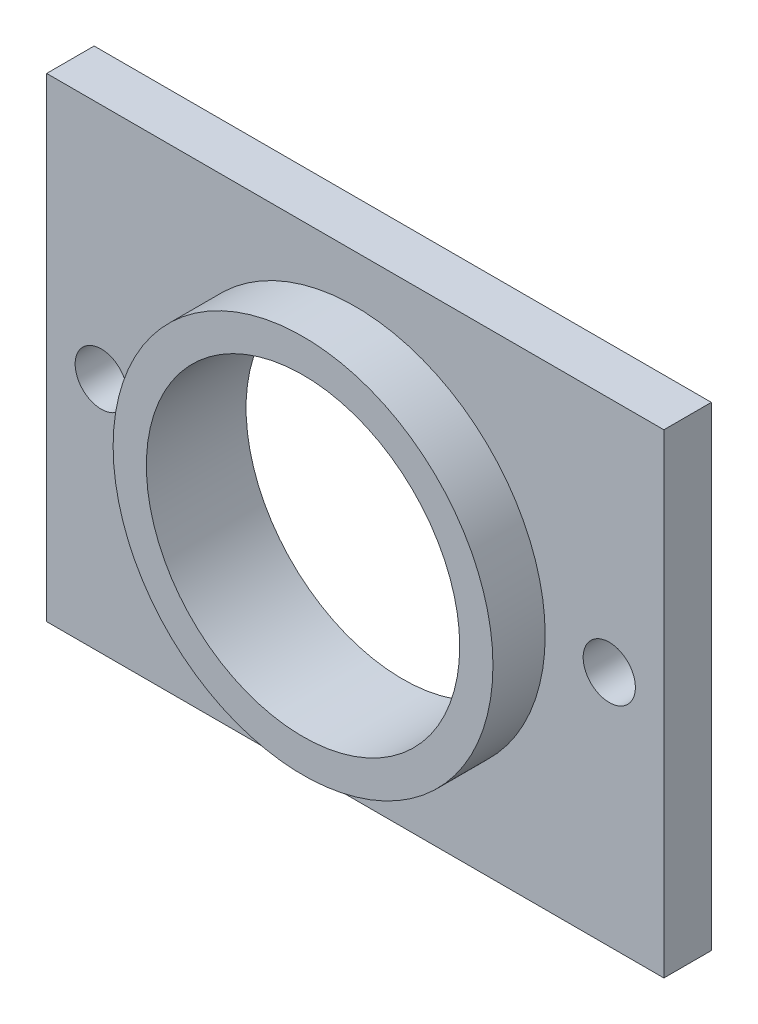
ISO-10303-21;
HEADER;
FILE_DESCRIPTION(('STEP AP214'),'2;1');
FILE_NAME('part.step','',(''),(''),'','','');
FILE_SCHEMA(('AUTOMOTIVE_DESIGN { 1 0 10303 214 1 1 1 1 }'));
ENDSEC;
DATA;
#1=APPLICATION_CONTEXT('core data for automotive mechanical design processes');
#2=APPLICATION_PROTOCOL_DEFINITION('international standard','automotive_design',2000,#1);
#3=PRODUCT_CONTEXT('',#1,'mechanical');
#4=PRODUCT('Part','Part','',(#3));
#5=PRODUCT_RELATED_PRODUCT_CATEGORY('part','',(#4));
#6=PRODUCT_DEFINITION_FORMATION('','',#4);
#7=PRODUCT_DEFINITION_CONTEXT('part definition',#1,'design');
#8=PRODUCT_DEFINITION('design','',#6,#7);
#9=PRODUCT_DEFINITION_SHAPE('','',#8);
#10=(LENGTH_UNIT() NAMED_UNIT(*) SI_UNIT(.MILLI.,.METRE.));
#11=(NAMED_UNIT(*) PLANE_ANGLE_UNIT() SI_UNIT($,.RADIAN.));
#12=(NAMED_UNIT(*) SI_UNIT($,.STERADIAN.) SOLID_ANGLE_UNIT());
#13=UNCERTAINTY_MEASURE_WITH_UNIT(LENGTH_MEASURE(1.E-05),#10,'distance_accuracy_value','');
#14=(GEOMETRIC_REPRESENTATION_CONTEXT(3) GLOBAL_UNCERTAINTY_ASSIGNED_CONTEXT((#13)) GLOBAL_UNIT_ASSIGNED_CONTEXT((#10,
#11,#12)) REPRESENTATION_CONTEXT('',''));
#15=CARTESIAN_POINT('',(0.,0.,0.));
#16=DIRECTION('',(0.,0.,1.));
#17=DIRECTION('',(1.,0.,0.));
#18=AXIS2_PLACEMENT_3D('',#15,#16,#17);
#19=CARTESIAN_POINT('',(0.,0.,-10.4));
#20=DIRECTION('',(0.,0.,-1.));
#21=DIRECTION('',(-1.,0.,0.));
#22=AXIS2_PLACEMENT_3D('',#19,#20,#21);
#23=PLANE('',#22);
#24=CARTESIAN_POINT('',(23.2,0.,-10.4));
#25=DIRECTION('',(0.,0.,1.));
#26=DIRECTION('',(1.,0.,0.));
#27=AXIS2_PLACEMENT_3D('',#24,#25,#26);
#28=CIRCLE('',#27,1.1);
#29=CARTESIAN_POINT('',(24.3,0.,-10.4));
#30=VERTEX_POINT('',#29);
#31=EDGE_CURVE('E129',#30,#30,#28,.T.);
#32=ORIENTED_EDGE('',*,*,#31,.F.);
#33=EDGE_LOOP('',(#32));
#34=FACE_BOUND('',#33,.T.);
#35=CARTESIAN_POINT('',(1.8,0.,-10.4));
#36=DIRECTION('',(0.,0.,1.));
#37=DIRECTION('',(1.,0.,0.));
#38=AXIS2_PLACEMENT_3D('',#35,#36,#37);
#39=CIRCLE('',#38,1.1);
#40=CARTESIAN_POINT('',(2.9,0.,-10.4));
#41=VERTEX_POINT('',#40);
#42=EDGE_CURVE('E138',#41,#41,#39,.T.);
#43=ORIENTED_EDGE('',*,*,#42,.F.);
#44=EDGE_LOOP('',(#43));
#45=FACE_BOUND('',#44,.T.);
#46=DIRECTION('',(0.,-1.,0.));
#47=VECTOR('',#46,1.);
#48=CARTESIAN_POINT('',(-0.5,-10.,-10.4));
#49=LINE('',#48,#47);
#50=CARTESIAN_POINT('',(-0.5,10.,-10.4));
#51=VERTEX_POINT('',#50);
#52=CARTESIAN_POINT('',(-0.5,-10.,-10.4));
#53=VERTEX_POINT('',#52);
#54=EDGE_CURVE('E95',#51,#53,#49,.T.);
#55=ORIENTED_EDGE('',*,*,#54,.T.);
#56=DIRECTION('',(1.,0.,0.));
#57=VECTOR('',#56,1.);
#58=CARTESIAN_POINT('',(-0.5,-10.,-10.4));
#59=LINE('',#58,#57);
#60=CARTESIAN_POINT('',(25.5,-10.,-10.4));
#61=VERTEX_POINT('',#60);
#62=EDGE_CURVE('E87',#53,#61,#59,.T.);
#63=ORIENTED_EDGE('',*,*,#62,.T.);
#64=DIRECTION('',(0.,1.,0.));
#65=VECTOR('',#64,1.);
#66=CARTESIAN_POINT('',(25.5,-10.,-10.4));
#67=LINE('',#66,#65);
#68=CARTESIAN_POINT('',(25.5,10.,-10.4));
#69=VERTEX_POINT('',#68);
#70=EDGE_CURVE('E89',#61,#69,#67,.T.);
#71=ORIENTED_EDGE('',*,*,#70,.T.);
#72=DIRECTION('',(-1.,0.,0.));
#73=VECTOR('',#72,1.);
#74=CARTESIAN_POINT('',(-0.5,10.,-10.4));
#75=LINE('',#74,#73);
#76=EDGE_CURVE('E57',#69,#51,#75,.T.);
#77=ORIENTED_EDGE('',*,*,#76,.T.);
#78=EDGE_LOOP('',(#55,#63,#71,#77));
#79=FACE_BOUND('',#78,.T.);
#80=CARTESIAN_POINT('',(12.5,0.,-10.4));
#81=DIRECTION('',(0.,0.,-1.));
#82=DIRECTION('',(-1.,0.,0.));
#83=AXIS2_PLACEMENT_3D('',#80,#81,#82);
#84=CIRCLE('',#83,8.);
#85=CARTESIAN_POINT('',(4.5,0.,-10.4));
#86=VERTEX_POINT('',#85);
#87=EDGE_CURVE('E11',#86,#86,#84,.F.);
#88=ORIENTED_EDGE('',*,*,#87,.F.);
#89=EDGE_LOOP('',(#88));
#90=FACE_BOUND('',#89,.T.);
#91=ADVANCED_FACE('F39',(#34,#45,#79,#90),#23,.F.);
#92=CARTESIAN_POINT('',(0.,0.,-12.4));
#93=DIRECTION('',(0.,0.,-1.));
#94=DIRECTION('',(-1.,0.,0.));
#95=AXIS2_PLACEMENT_3D('',#92,#93,#94);
#96=PLANE('',#95);
#97=CARTESIAN_POINT('',(1.8,0.,-12.4));
#98=DIRECTION('',(0.,0.,1.));
#99=DIRECTION('',(1.,0.,0.));
#100=AXIS2_PLACEMENT_3D('',#97,#98,#99);
#101=CIRCLE('',#100,1.1);
#102=CARTESIAN_POINT('',(2.9,0.,-12.4));
#103=VERTEX_POINT('',#102);
#104=EDGE_CURVE('E134',#103,#103,#101,.T.);
#105=ORIENTED_EDGE('',*,*,#104,.T.);
#106=EDGE_LOOP('',(#105));
#107=FACE_BOUND('',#106,.T.);
#108=DIRECTION('',(0.,-1.,0.));
#109=VECTOR('',#108,1.);
#110=CARTESIAN_POINT('',(-0.5,-10.,-12.4));
#111=LINE('',#110,#109);
#112=CARTESIAN_POINT('',(-0.5,10.,-12.4));
#113=VERTEX_POINT('',#112);
#114=CARTESIAN_POINT('',(-0.5,-10.,-12.4));
#115=VERTEX_POINT('',#114);
#116=EDGE_CURVE('E106',#113,#115,#111,.T.);
#117=ORIENTED_EDGE('',*,*,#116,.F.);
#118=DIRECTION('',(-1.,0.,0.));
#119=VECTOR('',#118,1.);
#120=CARTESIAN_POINT('',(-0.5,10.,-12.4));
#121=LINE('',#120,#119);
#122=CARTESIAN_POINT('',(25.5,10.,-12.4));
#123=VERTEX_POINT('',#122);
#124=EDGE_CURVE('E76',#123,#113,#121,.T.);
#125=ORIENTED_EDGE('',*,*,#124,.F.);
#126=DIRECTION('',(0.,1.,0.));
#127=VECTOR('',#126,1.);
#128=CARTESIAN_POINT('',(25.5,-10.,-12.4));
#129=LINE('',#128,#127);
#130=CARTESIAN_POINT('',(25.5,-10.,-12.4));
#131=VERTEX_POINT('',#130);
#132=EDGE_CURVE('E71',#131,#123,#129,.T.);
#133=ORIENTED_EDGE('',*,*,#132,.F.);
#134=DIRECTION('',(1.,0.,0.));
#135=VECTOR('',#134,1.);
#136=CARTESIAN_POINT('',(-0.5,-10.,-12.4));
#137=LINE('',#136,#135);
#138=EDGE_CURVE('E100',#115,#131,#137,.T.);
#139=ORIENTED_EDGE('',*,*,#138,.F.);
#140=EDGE_LOOP('',(#117,#125,#133,#139));
#141=FACE_BOUND('',#140,.T.);
#142=CARTESIAN_POINT('',(12.5,0.,-12.4));
#143=DIRECTION('',(0.,0.,1.));
#144=DIRECTION('',(1.,0.,0.));
#145=AXIS2_PLACEMENT_3D('',#142,#143,#144);
#146=CIRCLE('',#145,6.6);
#147=CARTESIAN_POINT('',(19.1,0.,-12.4));
#148=VERTEX_POINT('',#147);
#149=EDGE_CURVE('E108',#148,#148,#146,.T.);
#150=ORIENTED_EDGE('',*,*,#149,.T.);
#151=EDGE_LOOP('',(#150));
#152=FACE_BOUND('',#151,.T.);
#153=CARTESIAN_POINT('',(23.2,0.,-12.4));
#154=DIRECTION('',(0.,0.,1.));
#155=DIRECTION('',(1.,0.,0.));
#156=AXIS2_PLACEMENT_3D('',#153,#154,#155);
#157=CIRCLE('',#156,1.1);
#158=CARTESIAN_POINT('',(24.3,0.,-12.4));
#159=VERTEX_POINT('',#158);
#160=EDGE_CURVE('E130',#159,#159,#157,.T.);
#161=ORIENTED_EDGE('',*,*,#160,.T.);
#162=EDGE_LOOP('',(#161));
#163=FACE_BOUND('',#162,.T.);
#164=ADVANCED_FACE('F120',(#107,#141,#152,#163),#96,.T.);
#165=CARTESIAN_POINT('',(-0.5,-10.,-10.4));
#166=DIRECTION('',(1.,0.,0.));
#167=DIRECTION('',(0.,0.,-1.));
#168=AXIS2_PLACEMENT_3D('',#165,#166,#167);
#169=PLANE('',#168);
#170=ORIENTED_EDGE('',*,*,#116,.T.);
#171=DIRECTION('',(0.,0.,-1.));
#172=VECTOR('',#171,1.);
#173=CARTESIAN_POINT('',(-0.5,-10.,-10.4));
#174=LINE('',#173,#172);
#175=EDGE_CURVE('E48',#53,#115,#174,.T.);
#176=ORIENTED_EDGE('',*,*,#175,.F.);
#177=ORIENTED_EDGE('',*,*,#54,.F.);
#178=DIRECTION('',(0.,0.,-1.));
#179=VECTOR('',#178,1.);
#180=CARTESIAN_POINT('',(-0.5,10.,-10.4));
#181=LINE('',#180,#179);
#182=EDGE_CURVE('E105',#51,#113,#181,.T.);
#183=ORIENTED_EDGE('',*,*,#182,.T.);
#184=EDGE_LOOP('',(#170,#176,#177,#183));
#185=FACE_BOUND('',#184,.T.);
#186=ADVANCED_FACE('F41',(#185),#169,.F.);
#187=CARTESIAN_POINT('',(-0.5,-10.,-10.4));
#188=DIRECTION('',(0.,1.,0.));
#189=DIRECTION('',(0.,0.,1.));
#190=AXIS2_PLACEMENT_3D('',#187,#188,#189);
#191=PLANE('',#190);
#192=ORIENTED_EDGE('',*,*,#138,.T.);
#193=DIRECTION('',(0.,0.,-1.));
#194=VECTOR('',#193,1.);
#195=CARTESIAN_POINT('',(25.5,-10.,-10.4));
#196=LINE('',#195,#194);
#197=EDGE_CURVE('E92',#61,#131,#196,.T.);
#198=ORIENTED_EDGE('',*,*,#197,.F.);
#199=ORIENTED_EDGE('',*,*,#62,.F.);
#200=ORIENTED_EDGE('',*,*,#175,.T.);
#201=EDGE_LOOP('',(#192,#198,#199,#200));
#202=FACE_BOUND('',#201,.T.);
#203=ADVANCED_FACE('F96',(#202),#191,.F.);
#204=CARTESIAN_POINT('',(25.5,-10.,-10.4));
#205=DIRECTION('',(-1.,0.,0.));
#206=DIRECTION('',(0.,0.,1.));
#207=AXIS2_PLACEMENT_3D('',#204,#205,#206);
#208=PLANE('',#207);
#209=ORIENTED_EDGE('',*,*,#132,.T.);
#210=DIRECTION('',(0.,0.,-1.));
#211=VECTOR('',#210,1.);
#212=CARTESIAN_POINT('',(25.5,10.,-10.4));
#213=LINE('',#212,#211);
#214=EDGE_CURVE('E98',#69,#123,#213,.T.);
#215=ORIENTED_EDGE('',*,*,#214,.F.);
#216=ORIENTED_EDGE('',*,*,#70,.F.);
#217=ORIENTED_EDGE('',*,*,#197,.T.);
#218=EDGE_LOOP('',(#209,#215,#216,#217));
#219=FACE_BOUND('',#218,.T.);
#220=ADVANCED_FACE('F99',(#219),#208,.F.);
#221=CARTESIAN_POINT('',(-0.5,10.,-10.4));
#222=DIRECTION('',(0.,-1.,0.));
#223=DIRECTION('',(0.,0.,-1.));
#224=AXIS2_PLACEMENT_3D('',#221,#222,#223);
#225=PLANE('',#224);
#226=ORIENTED_EDGE('',*,*,#124,.T.);
#227=ORIENTED_EDGE('',*,*,#182,.F.);
#228=ORIENTED_EDGE('',*,*,#76,.F.);
#229=ORIENTED_EDGE('',*,*,#214,.T.);
#230=EDGE_LOOP('',(#226,#227,#228,#229));
#231=FACE_BOUND('',#230,.T.);
#232=ADVANCED_FACE('F159',(#231),#225,.F.);
#233=CARTESIAN_POINT('',(12.5,0.,-10.4));
#234=DIRECTION('',(0.,0.,-1.));
#235=DIRECTION('',(-1.,0.,0.));
#236=AXIS2_PLACEMENT_3D('',#233,#234,#235);
#237=CYLINDRICAL_SURFACE('',#236,6.6);
#238=ORIENTED_EDGE('',*,*,#149,.F.);
#239=EDGE_LOOP('',(#238));
#240=FACE_BOUND('',#239,.T.);
#241=CARTESIAN_POINT('',(12.5,0.,-8.2));
#242=DIRECTION('',(0.,0.,1.));
#243=DIRECTION('',(1.,0.,0.));
#244=AXIS2_PLACEMENT_3D('',#241,#242,#243);
#245=CIRCLE('',#244,6.6);
#246=CARTESIAN_POINT('',(19.1,0.,-8.2));
#247=VERTEX_POINT('',#246);
#248=EDGE_CURVE('E136',#247,#247,#245,.T.);
#249=ORIENTED_EDGE('',*,*,#248,.T.);
#250=EDGE_LOOP('',(#249));
#251=FACE_BOUND('',#250,.T.);
#252=ADVANCED_FACE('F149',(#240,#251),#237,.F.);
#253=CARTESIAN_POINT('',(1.8,0.,-10.4));
#254=DIRECTION('',(0.,0.,-1.));
#255=DIRECTION('',(-1.,0.,0.));
#256=AXIS2_PLACEMENT_3D('',#253,#254,#255);
#257=CYLINDRICAL_SURFACE('',#256,1.1);
#258=ORIENTED_EDGE('',*,*,#42,.T.);
#259=EDGE_LOOP('',(#258));
#260=FACE_BOUND('',#259,.T.);
#261=ORIENTED_EDGE('',*,*,#104,.F.);
#262=EDGE_LOOP('',(#261));
#263=FACE_BOUND('',#262,.T.);
#264=ADVANCED_FACE('F148',(#260,#263),#257,.F.);
#265=CARTESIAN_POINT('',(23.2,0.,-10.4));
#266=DIRECTION('',(0.,0.,-1.));
#267=DIRECTION('',(-1.,0.,0.));
#268=AXIS2_PLACEMENT_3D('',#265,#266,#267);
#269=CYLINDRICAL_SURFACE('',#268,1.1);
#270=ORIENTED_EDGE('',*,*,#31,.T.);
#271=EDGE_LOOP('',(#270));
#272=FACE_BOUND('',#271,.T.);
#273=ORIENTED_EDGE('',*,*,#160,.F.);
#274=EDGE_LOOP('',(#273));
#275=FACE_BOUND('',#274,.T.);
#276=ADVANCED_FACE('F146',(#272,#275),#269,.F.);
#277=CARTESIAN_POINT('',(12.5,0.,-8.2));
#278=DIRECTION('',(0.,0.,-1.));
#279=DIRECTION('',(-1.,0.,0.));
#280=AXIS2_PLACEMENT_3D('',#277,#278,#279);
#281=CYLINDRICAL_SURFACE('',#280,8.);
#282=CARTESIAN_POINT('',(12.5,0.,-8.2));
#283=DIRECTION('',(0.,0.,1.));
#284=DIRECTION('',(1.,0.,0.));
#285=AXIS2_PLACEMENT_3D('',#282,#283,#284);
#286=CIRCLE('',#285,8.);
#287=CARTESIAN_POINT('',(20.5,0.,-8.2));
#288=VERTEX_POINT('',#287);
#289=EDGE_CURVE('E128',#288,#288,#286,.T.);
#290=ORIENTED_EDGE('',*,*,#289,.F.);
#291=EDGE_LOOP('',(#290));
#292=FACE_BOUND('',#291,.T.);
#293=ORIENTED_EDGE('',*,*,#87,.T.);
#294=EDGE_LOOP('',(#293));
#295=FACE_BOUND('',#294,.T.);
#296=ADVANCED_FACE('F156',(#292,#295),#281,.T.);
#297=CARTESIAN_POINT('',(12.5,0.,-8.2));
#298=DIRECTION('',(0.,0.,1.));
#299=DIRECTION('',(1.,0.,0.));
#300=AXIS2_PLACEMENT_3D('',#297,#298,#299);
#301=PLANE('',#300);
#302=ORIENTED_EDGE('',*,*,#289,.T.);
#303=EDGE_LOOP('',(#302));
#304=FACE_BOUND('',#303,.T.);
#305=ORIENTED_EDGE('',*,*,#248,.F.);
#306=EDGE_LOOP('',(#305));
#307=FACE_BOUND('',#306,.T.);
#308=ADVANCED_FACE('F230',(#304,#307),#301,.T.);
#309=CLOSED_SHELL('',(#91,#164,#186,#203,#220,#232,#252,#264,#276,#296,#308));
#310=MANIFOLD_SOLID_BREP('B2',#309);
#311=ADVANCED_BREP_SHAPE_REPRESENTATION('',(#18,#310),#14);
#312=SHAPE_DEFINITION_REPRESENTATION(#9,#311);
ENDSEC;
END-ISO-10303-21;
